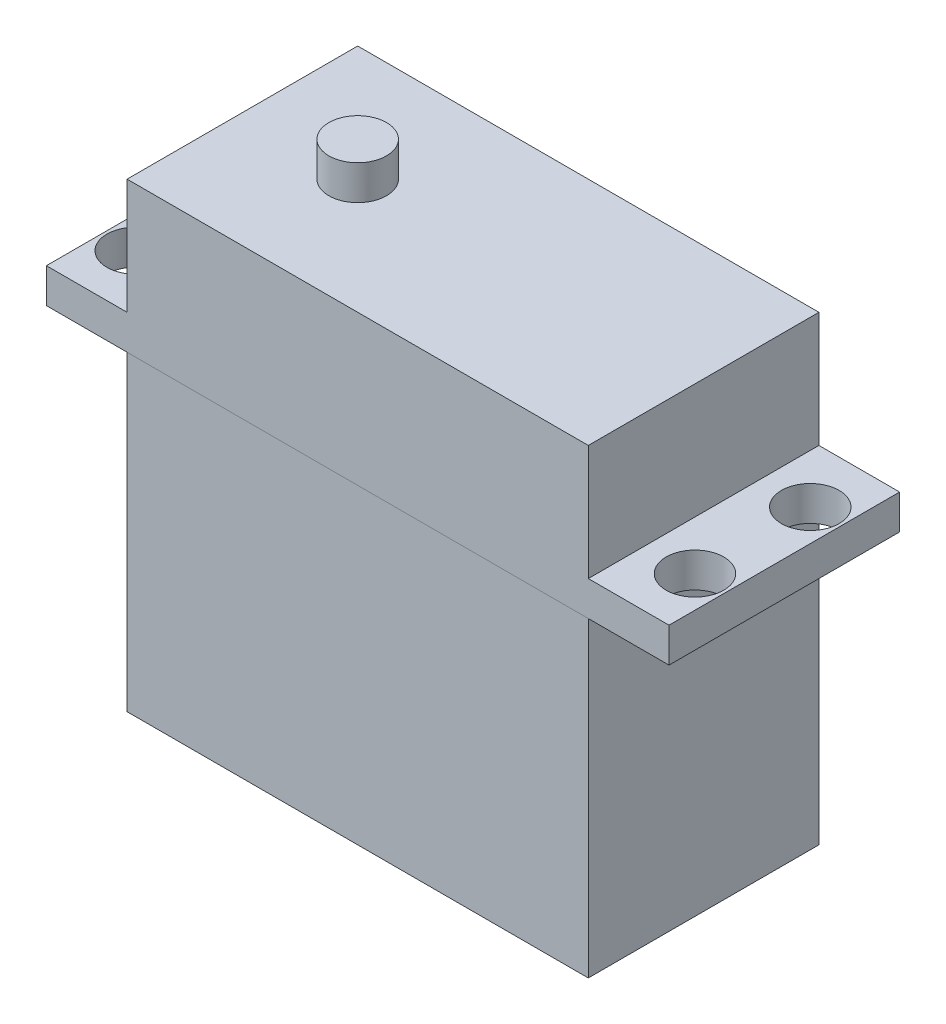
ISO-10303-21;
HEADER;
FILE_DESCRIPTION(('STEP AP214'),'2;1');
FILE_NAME('part.step','',(''),(''),'','','');
FILE_SCHEMA(('AUTOMOTIVE_DESIGN { 1 0 10303 214 1 1 1 1 }'));
ENDSEC;
DATA;
#1=APPLICATION_CONTEXT('core data for automotive mechanical design processes');
#2=APPLICATION_PROTOCOL_DEFINITION('international standard','automotive_design',2000,#1);
#3=PRODUCT_CONTEXT('',#1,'mechanical');
#4=PRODUCT('Part','Part','',(#3));
#5=PRODUCT_RELATED_PRODUCT_CATEGORY('part','',(#4));
#6=PRODUCT_DEFINITION_FORMATION('','',#4);
#7=PRODUCT_DEFINITION_CONTEXT('part definition',#1,'design');
#8=PRODUCT_DEFINITION('design','',#6,#7);
#9=PRODUCT_DEFINITION_SHAPE('','',#8);
#10=(LENGTH_UNIT() NAMED_UNIT(*) SI_UNIT(.MILLI.,.METRE.));
#11=(NAMED_UNIT(*) PLANE_ANGLE_UNIT() SI_UNIT($,.RADIAN.));
#12=(NAMED_UNIT(*) SI_UNIT($,.STERADIAN.) SOLID_ANGLE_UNIT());
#13=UNCERTAINTY_MEASURE_WITH_UNIT(LENGTH_MEASURE(1.E-05),#10,'distance_accuracy_value','');
#14=(GEOMETRIC_REPRESENTATION_CONTEXT(3) GLOBAL_UNCERTAINTY_ASSIGNED_CONTEXT((#13)) GLOBAL_UNIT_ASSIGNED_CONTEXT((#10,
#11,#12)) REPRESENTATION_CONTEXT('',''));
#15=CARTESIAN_POINT('',(0.,0.,0.));
#16=DIRECTION('',(0.,0.,1.));
#17=DIRECTION('',(1.,0.,0.));
#18=AXIS2_PLACEMENT_3D('',#15,#16,#17);
#19=CARTESIAN_POINT('',(0.,30.,0.));
#20=DIRECTION('',(0.,-1.,0.));
#21=DIRECTION('',(0.,0.,-1.));
#22=AXIS2_PLACEMENT_3D('',#19,#20,#21);
#23=PLANE('',#22);
#24=CARTESIAN_POINT('',(24.25,30.,-5.));
#25=DIRECTION('',(0.,1.,0.));
#26=DIRECTION('',(0.,0.,1.));
#27=AXIS2_PLACEMENT_3D('',#24,#25,#26);
#28=CIRCLE('',#27,2.5);
#29=CARTESIAN_POINT('',(24.25,30.,-2.5));
#30=VERTEX_POINT('',#29);
#31=EDGE_CURVE('E140',#30,#30,#28,.T.);
#32=ORIENTED_EDGE('',*,*,#31,.F.);
#33=EDGE_LOOP('',(#32));
#34=FACE_BOUND('',#33,.T.);
#35=CARTESIAN_POINT('',(24.25,30.,5.));
#36=DIRECTION('',(0.,1.,0.));
#37=DIRECTION('',(0.,0.,1.));
#38=AXIS2_PLACEMENT_3D('',#35,#36,#37);
#39=CIRCLE('',#38,2.5);
#40=CARTESIAN_POINT('',(24.25,30.,7.5));
#41=VERTEX_POINT('',#40);
#42=EDGE_CURVE('E149',#41,#41,#39,.T.);
#43=ORIENTED_EDGE('',*,*,#42,.F.);
#44=EDGE_LOOP('',(#43));
#45=FACE_BOUND('',#44,.T.);
#46=DIRECTION('',(0.,0.,-1.));
#47=VECTOR('',#46,1.);
#48=CARTESIAN_POINT('',(20.,30.,10.));
#49=LINE('',#48,#47);
#50=CARTESIAN_POINT('',(20.,30.,10.));
#51=VERTEX_POINT('',#50);
#52=CARTESIAN_POINT('',(20.,30.,-10.));
#53=VERTEX_POINT('',#52);
#54=EDGE_CURVE('E66',#51,#53,#49,.T.);
#55=ORIENTED_EDGE('',*,*,#54,.F.);
#56=DIRECTION('',(1.,0.,0.));
#57=VECTOR('',#56,1.);
#58=CARTESIAN_POINT('',(-27.,30.,10.));
#59=LINE('',#58,#57);
#60=CARTESIAN_POINT('',(27.,30.,10.));
#61=VERTEX_POINT('',#60);
#62=EDGE_CURVE('E176',#51,#61,#59,.T.);
#63=ORIENTED_EDGE('',*,*,#62,.T.);
#64=DIRECTION('',(0.,0.,-1.));
#65=VECTOR('',#64,1.);
#66=CARTESIAN_POINT('',(27.,30.,10.));
#67=LINE('',#66,#65);
#68=CARTESIAN_POINT('',(27.,30.,-10.));
#69=VERTEX_POINT('',#68);
#70=EDGE_CURVE('E167',#61,#69,#67,.T.);
#71=ORIENTED_EDGE('',*,*,#70,.T.);
#72=DIRECTION('',(-1.,0.,0.));
#73=VECTOR('',#72,1.);
#74=CARTESIAN_POINT('',(-27.,30.,-10.));
#75=LINE('',#74,#73);
#76=EDGE_CURVE('E172',#69,#53,#75,.T.);
#77=ORIENTED_EDGE('',*,*,#76,.T.);
#78=EDGE_LOOP('',(#55,#63,#71,#77));
#79=FACE_BOUND('',#78,.T.);
#80=ADVANCED_FACE('F51',(#34,#45,#79),#23,.F.);
#81=CARTESIAN_POINT('',(-24.25,30.,5.));
#82=DIRECTION('',(0.,1.,0.));
#83=DIRECTION('',(0.,0.,1.));
#84=AXIS2_PLACEMENT_3D('',#81,#82,#83);
#85=CIRCLE('',#84,2.5);
#86=CARTESIAN_POINT('',(-24.25,30.,7.5));
#87=VERTEX_POINT('',#86);
#88=EDGE_CURVE('E155',#87,#87,#85,.T.);
#89=ORIENTED_EDGE('',*,*,#88,.F.);
#90=EDGE_LOOP('',(#89));
#91=FACE_BOUND('',#90,.T.);
#92=CARTESIAN_POINT('',(-24.25,30.,-5.));
#93=DIRECTION('',(0.,1.,0.));
#94=DIRECTION('',(0.,0.,1.));
#95=AXIS2_PLACEMENT_3D('',#92,#93,#94);
#96=CIRCLE('',#95,2.5);
#97=CARTESIAN_POINT('',(-24.25,30.,-2.5));
#98=VERTEX_POINT('',#97);
#99=EDGE_CURVE('E161',#98,#98,#96,.T.);
#100=ORIENTED_EDGE('',*,*,#99,.F.);
#101=EDGE_LOOP('',(#100));
#102=FACE_BOUND('',#101,.T.);
#103=DIRECTION('',(0.,0.,1.));
#104=VECTOR('',#103,1.);
#105=CARTESIAN_POINT('',(-20.,30.,10.));
#106=LINE('',#105,#104);
#107=CARTESIAN_POINT('',(-20.,30.,-10.));
#108=VERTEX_POINT('',#107);
#109=CARTESIAN_POINT('',(-20.,30.,10.));
#110=VERTEX_POINT('',#109);
#111=EDGE_CURVE('E74',#108,#110,#106,.T.);
#112=ORIENTED_EDGE('',*,*,#111,.F.);
#113=CARTESIAN_POINT('',(-27.,30.,-10.));
#114=VERTEX_POINT('',#113);
#115=EDGE_CURVE('E170',#108,#114,#75,.T.);
#116=ORIENTED_EDGE('',*,*,#115,.T.);
#117=DIRECTION('',(0.,0.,1.));
#118=VECTOR('',#117,1.);
#119=CARTESIAN_POINT('',(-27.,30.,10.));
#120=LINE('',#119,#118);
#121=CARTESIAN_POINT('',(-27.,30.,10.));
#122=VERTEX_POINT('',#121);
#123=EDGE_CURVE('E174',#114,#122,#120,.T.);
#124=ORIENTED_EDGE('',*,*,#123,.T.);
#125=EDGE_CURVE('E177',#122,#110,#59,.T.);
#126=ORIENTED_EDGE('',*,*,#125,.T.);
#127=EDGE_LOOP('',(#112,#116,#124,#126));
#128=FACE_BOUND('',#127,.T.);
#129=ADVANCED_FACE('F215',(#91,#102,#128),#23,.F.);
#130=CARTESIAN_POINT('',(0.,27.,0.));
#131=DIRECTION('',(0.,-1.,0.));
#132=DIRECTION('',(0.,0.,-1.));
#133=AXIS2_PLACEMENT_3D('',#130,#131,#132);
#134=PLANE('',#133);
#135=CARTESIAN_POINT('',(24.25,27.,5.));
#136=DIRECTION('',(0.,1.,0.));
#137=DIRECTION('',(0.,0.,1.));
#138=AXIS2_PLACEMENT_3D('',#135,#136,#137);
#139=CIRCLE('',#138,2.5);
#140=CARTESIAN_POINT('',(24.25,27.,7.5));
#141=VERTEX_POINT('',#140);
#142=EDGE_CURVE('E147',#141,#141,#139,.T.);
#143=ORIENTED_EDGE('',*,*,#142,.T.);
#144=EDGE_LOOP('',(#143));
#145=FACE_BOUND('',#144,.T.);
#146=CARTESIAN_POINT('',(-24.25,27.,-5.));
#147=DIRECTION('',(0.,1.,0.));
#148=DIRECTION('',(0.,0.,1.));
#149=AXIS2_PLACEMENT_3D('',#146,#147,#148);
#150=CIRCLE('',#149,2.5);
#151=CARTESIAN_POINT('',(-24.25,27.,-2.5));
#152=VERTEX_POINT('',#151);
#153=EDGE_CURVE('E158',#152,#152,#150,.T.);
#154=ORIENTED_EDGE('',*,*,#153,.T.);
#155=EDGE_LOOP('',(#154));
#156=FACE_BOUND('',#155,.T.);
#157=DIRECTION('',(0.,0.,-1.));
#158=VECTOR('',#157,1.);
#159=CARTESIAN_POINT('',(27.,27.,10.));
#160=LINE('',#159,#158);
#161=CARTESIAN_POINT('',(27.,27.,10.));
#162=VERTEX_POINT('',#161);
#163=CARTESIAN_POINT('',(27.,27.,-10.));
#164=VERTEX_POINT('',#163);
#165=EDGE_CURVE('E164',#162,#164,#160,.T.);
#166=ORIENTED_EDGE('',*,*,#165,.F.);
#167=DIRECTION('',(1.,0.,0.));
#168=VECTOR('',#167,1.);
#169=CARTESIAN_POINT('',(-27.,27.,10.));
#170=LINE('',#169,#168);
#171=CARTESIAN_POINT('',(-27.,27.,10.));
#172=VERTEX_POINT('',#171);
#173=EDGE_CURVE('E171',#172,#162,#170,.T.);
#174=ORIENTED_EDGE('',*,*,#173,.F.);
#175=DIRECTION('',(0.,0.,1.));
#176=VECTOR('',#175,1.);
#177=CARTESIAN_POINT('',(-27.,27.,10.));
#178=LINE('',#177,#176);
#179=CARTESIAN_POINT('',(-27.,27.,-10.));
#180=VERTEX_POINT('',#179);
#181=EDGE_CURVE('E184',#180,#172,#178,.T.);
#182=ORIENTED_EDGE('',*,*,#181,.F.);
#183=DIRECTION('',(-1.,0.,0.));
#184=VECTOR('',#183,1.);
#185=CARTESIAN_POINT('',(-27.,27.,-10.));
#186=LINE('',#185,#184);
#187=EDGE_CURVE('E182',#164,#180,#186,.T.);
#188=ORIENTED_EDGE('',*,*,#187,.F.);
#189=EDGE_LOOP('',(#166,#174,#182,#188));
#190=FACE_BOUND('',#189,.T.);
#191=CARTESIAN_POINT('',(-24.25,27.,5.));
#192=DIRECTION('',(0.,1.,0.));
#193=DIRECTION('',(0.,0.,1.));
#194=AXIS2_PLACEMENT_3D('',#191,#192,#193);
#195=CIRCLE('',#194,2.5);
#196=CARTESIAN_POINT('',(-24.25,27.,7.5));
#197=VERTEX_POINT('',#196);
#198=EDGE_CURVE('E152',#197,#197,#195,.T.);
#199=ORIENTED_EDGE('',*,*,#198,.T.);
#200=EDGE_LOOP('',(#199));
#201=FACE_BOUND('',#200,.T.);
#202=CARTESIAN_POINT('',(24.25,27.,-5.));
#203=DIRECTION('',(0.,1.,0.));
#204=DIRECTION('',(0.,0.,1.));
#205=AXIS2_PLACEMENT_3D('',#202,#203,#204);
#206=CIRCLE('',#205,2.5);
#207=CARTESIAN_POINT('',(24.25,27.,-2.5));
#208=VERTEX_POINT('',#207);
#209=EDGE_CURVE('E137',#208,#208,#206,.T.);
#210=ORIENTED_EDGE('',*,*,#209,.T.);
#211=EDGE_LOOP('',(#210));
#212=FACE_BOUND('',#211,.T.);
#213=ADVANCED_FACE('F203',(#145,#156,#190,#201,#212),#134,.T.);
#214=CARTESIAN_POINT('',(27.,30.,10.));
#215=DIRECTION('',(-1.,0.,0.));
#216=DIRECTION('',(0.,0.,1.));
#217=AXIS2_PLACEMENT_3D('',#214,#215,#216);
#218=PLANE('',#217);
#219=ORIENTED_EDGE('',*,*,#165,.T.);
#220=DIRECTION('',(0.,-1.,0.));
#221=VECTOR('',#220,1.);
#222=CARTESIAN_POINT('',(27.,30.,-10.));
#223=LINE('',#222,#221);
#224=EDGE_CURVE('E59',#69,#164,#223,.T.);
#225=ORIENTED_EDGE('',*,*,#224,.F.);
#226=ORIENTED_EDGE('',*,*,#70,.F.);
#227=DIRECTION('',(0.,-1.,0.));
#228=VECTOR('',#227,1.);
#229=CARTESIAN_POINT('',(27.,30.,10.));
#230=LINE('',#229,#228);
#231=EDGE_CURVE('E179',#61,#162,#230,.T.);
#232=ORIENTED_EDGE('',*,*,#231,.T.);
#233=EDGE_LOOP('',(#219,#225,#226,#232));
#234=FACE_BOUND('',#233,.T.);
#235=ADVANCED_FACE('F53',(#234),#218,.F.);
#236=CARTESIAN_POINT('',(-27.,30.,-10.));
#237=DIRECTION('',(0.,0.,1.));
#238=DIRECTION('',(1.,0.,0.));
#239=AXIS2_PLACEMENT_3D('',#236,#237,#238);
#240=PLANE('',#239);
#241=ORIENTED_EDGE('',*,*,#187,.T.);
#242=DIRECTION('',(0.,-1.,0.));
#243=VECTOR('',#242,1.);
#244=CARTESIAN_POINT('',(-27.,30.,-10.));
#245=LINE('',#244,#243);
#246=EDGE_CURVE('E192',#114,#180,#245,.T.);
#247=ORIENTED_EDGE('',*,*,#246,.F.);
#248=ORIENTED_EDGE('',*,*,#115,.F.);
#249=DIRECTION('',(0.,-1.,0.));
#250=VECTOR('',#249,1.);
#251=CARTESIAN_POINT('',(-20.,40.,-10.));
#252=LINE('',#251,#250);
#253=CARTESIAN_POINT('',(-20.,40.,-10.));
#254=VERTEX_POINT('',#253);
#255=EDGE_CURVE('E122',#254,#108,#252,.T.);
#256=ORIENTED_EDGE('',*,*,#255,.F.);
#257=DIRECTION('',(-1.,0.,0.));
#258=VECTOR('',#257,1.);
#259=CARTESIAN_POINT('',(-20.,40.,-10.));
#260=LINE('',#259,#258);
#261=CARTESIAN_POINT('',(20.,40.,-10.));
#262=VERTEX_POINT('',#261);
#263=EDGE_CURVE('E116',#262,#254,#260,.T.);
#264=ORIENTED_EDGE('',*,*,#263,.F.);
#265=DIRECTION('',(0.,-1.,0.));
#266=VECTOR('',#265,1.);
#267=CARTESIAN_POINT('',(20.,40.,-10.));
#268=LINE('',#267,#266);
#269=EDGE_CURVE('E120',#262,#53,#268,.T.);
#270=ORIENTED_EDGE('',*,*,#269,.T.);
#271=ORIENTED_EDGE('',*,*,#76,.F.);
#272=ORIENTED_EDGE('',*,*,#224,.T.);
#273=EDGE_LOOP('',(#241,#247,#248,#256,#264,#270,#271,#272));
#274=FACE_BOUND('',#273,.T.);
#275=ADVANCED_FACE('F118',(#274),#240,.F.);
#276=CARTESIAN_POINT('',(-27.,30.,10.));
#277=DIRECTION('',(1.,0.,0.));
#278=DIRECTION('',(0.,0.,-1.));
#279=AXIS2_PLACEMENT_3D('',#276,#277,#278);
#280=PLANE('',#279);
#281=ORIENTED_EDGE('',*,*,#181,.T.);
#282=DIRECTION('',(0.,-1.,0.));
#283=VECTOR('',#282,1.);
#284=CARTESIAN_POINT('',(-27.,30.,10.));
#285=LINE('',#284,#283);
#286=EDGE_CURVE('E189',#122,#172,#285,.T.);
#287=ORIENTED_EDGE('',*,*,#286,.F.);
#288=ORIENTED_EDGE('',*,*,#123,.F.);
#289=ORIENTED_EDGE('',*,*,#246,.T.);
#290=EDGE_LOOP('',(#281,#287,#288,#289));
#291=FACE_BOUND('',#290,.T.);
#292=ADVANCED_FACE('F208',(#291),#280,.F.);
#293=CARTESIAN_POINT('',(-27.,30.,10.));
#294=DIRECTION('',(0.,0.,-1.));
#295=DIRECTION('',(-1.,0.,0.));
#296=AXIS2_PLACEMENT_3D('',#293,#294,#295);
#297=PLANE('',#296);
#298=ORIENTED_EDGE('',*,*,#173,.T.);
#299=ORIENTED_EDGE('',*,*,#231,.F.);
#300=ORIENTED_EDGE('',*,*,#62,.F.);
#301=DIRECTION('',(0.,-1.,0.));
#302=VECTOR('',#301,1.);
#303=CARTESIAN_POINT('',(20.,40.,10.));
#304=LINE('',#303,#302);
#305=CARTESIAN_POINT('',(20.,40.,10.));
#306=VERTEX_POINT('',#305);
#307=EDGE_CURVE('E223',#306,#51,#304,.T.);
#308=ORIENTED_EDGE('',*,*,#307,.F.);
#309=DIRECTION('',(1.,0.,0.));
#310=VECTOR('',#309,1.);
#311=CARTESIAN_POINT('',(-20.,40.,10.));
#312=LINE('',#311,#310);
#313=CARTESIAN_POINT('',(-20.,40.,10.));
#314=VERTEX_POINT('',#313);
#315=EDGE_CURVE('E131',#314,#306,#312,.T.);
#316=ORIENTED_EDGE('',*,*,#315,.F.);
#317=DIRECTION('',(0.,-1.,0.));
#318=VECTOR('',#317,1.);
#319=CARTESIAN_POINT('',(-20.,40.,10.));
#320=LINE('',#319,#318);
#321=EDGE_CURVE('E142',#314,#110,#320,.T.);
#322=ORIENTED_EDGE('',*,*,#321,.T.);
#323=ORIENTED_EDGE('',*,*,#125,.F.);
#324=ORIENTED_EDGE('',*,*,#286,.T.);
#325=EDGE_LOOP('',(#298,#299,#300,#308,#316,#322,#323,#324));
#326=FACE_BOUND('',#325,.T.);
#327=ADVANCED_FACE('F212',(#326),#297,.F.);
#328=CARTESIAN_POINT('',(-24.25,30.,-5.));
#329=DIRECTION('',(0.,-1.,0.));
#330=DIRECTION('',(0.,0.,-1.));
#331=AXIS2_PLACEMENT_3D('',#328,#329,#330);
#332=CYLINDRICAL_SURFACE('',#331,2.5);
#333=ORIENTED_EDGE('',*,*,#99,.T.);
#334=EDGE_LOOP('',(#333));
#335=FACE_BOUND('',#334,.T.);
#336=ORIENTED_EDGE('',*,*,#153,.F.);
#337=EDGE_LOOP('',(#336));
#338=FACE_BOUND('',#337,.T.);
#339=ADVANCED_FACE('F255',(#335,#338),#332,.F.);
#340=CARTESIAN_POINT('',(-24.25,30.,5.));
#341=DIRECTION('',(0.,-1.,0.));
#342=DIRECTION('',(0.,0.,-1.));
#343=AXIS2_PLACEMENT_3D('',#340,#341,#342);
#344=CYLINDRICAL_SURFACE('',#343,2.5);
#345=ORIENTED_EDGE('',*,*,#88,.T.);
#346=EDGE_LOOP('',(#345));
#347=FACE_BOUND('',#346,.T.);
#348=ORIENTED_EDGE('',*,*,#198,.F.);
#349=EDGE_LOOP('',(#348));
#350=FACE_BOUND('',#349,.T.);
#351=ADVANCED_FACE('F285',(#347,#350),#344,.F.);
#352=CARTESIAN_POINT('',(24.25,30.,5.));
#353=DIRECTION('',(0.,-1.,0.));
#354=DIRECTION('',(0.,0.,-1.));
#355=AXIS2_PLACEMENT_3D('',#352,#353,#354);
#356=CYLINDRICAL_SURFACE('',#355,2.5);
#357=ORIENTED_EDGE('',*,*,#42,.T.);
#358=EDGE_LOOP('',(#357));
#359=FACE_BOUND('',#358,.T.);
#360=ORIENTED_EDGE('',*,*,#142,.F.);
#361=EDGE_LOOP('',(#360));
#362=FACE_BOUND('',#361,.T.);
#363=ADVANCED_FACE('F293',(#359,#362),#356,.F.);
#364=CARTESIAN_POINT('',(24.25,30.,-5.));
#365=DIRECTION('',(0.,-1.,0.));
#366=DIRECTION('',(0.,0.,-1.));
#367=AXIS2_PLACEMENT_3D('',#364,#365,#366);
#368=CYLINDRICAL_SURFACE('',#367,2.5);
#369=ORIENTED_EDGE('',*,*,#31,.T.);
#370=EDGE_LOOP('',(#369));
#371=FACE_BOUND('',#370,.T.);
#372=ORIENTED_EDGE('',*,*,#209,.F.);
#373=EDGE_LOOP('',(#372));
#374=FACE_BOUND('',#373,.T.);
#375=ADVANCED_FACE('F300',(#371,#374),#368,.F.);
#376=CARTESIAN_POINT('',(20.,40.,10.));
#377=DIRECTION('',(-1.,0.,0.));
#378=DIRECTION('',(0.,0.,1.));
#379=AXIS2_PLACEMENT_3D('',#376,#377,#378);
#380=PLANE('',#379);
#381=ORIENTED_EDGE('',*,*,#54,.T.);
#382=ORIENTED_EDGE('',*,*,#269,.F.);
#383=DIRECTION('',(0.,0.,-1.));
#384=VECTOR('',#383,1.);
#385=CARTESIAN_POINT('',(20.,40.,10.));
#386=LINE('',#385,#384);
#387=EDGE_CURVE('E126',#306,#262,#386,.T.);
#388=ORIENTED_EDGE('',*,*,#387,.F.);
#389=ORIENTED_EDGE('',*,*,#307,.T.);
#390=EDGE_LOOP('',(#381,#382,#388,#389));
#391=FACE_BOUND('',#390,.T.);
#392=ADVANCED_FACE('F136',(#391),#380,.F.);
#393=CARTESIAN_POINT('',(-20.,40.,10.));
#394=DIRECTION('',(1.,0.,0.));
#395=DIRECTION('',(0.,0.,-1.));
#396=AXIS2_PLACEMENT_3D('',#393,#394,#395);
#397=PLANE('',#396);
#398=ORIENTED_EDGE('',*,*,#111,.T.);
#399=ORIENTED_EDGE('',*,*,#321,.F.);
#400=DIRECTION('',(0.,0.,1.));
#401=VECTOR('',#400,1.);
#402=CARTESIAN_POINT('',(-20.,40.,10.));
#403=LINE('',#402,#401);
#404=EDGE_CURVE('E125',#254,#314,#403,.T.);
#405=ORIENTED_EDGE('',*,*,#404,.F.);
#406=ORIENTED_EDGE('',*,*,#255,.T.);
#407=EDGE_LOOP('',(#398,#399,#405,#406));
#408=FACE_BOUND('',#407,.T.);
#409=ADVANCED_FACE('F217',(#408),#397,.F.);
#410=CARTESIAN_POINT('',(0.,40.,0.));
#411=DIRECTION('',(0.,-1.,0.));
#412=DIRECTION('',(0.,0.,-1.));
#413=AXIS2_PLACEMENT_3D('',#410,#411,#412);
#414=PLANE('',#413);
#415=CARTESIAN_POINT('',(-10.,40.,0.));
#416=DIRECTION('',(0.,-1.,0.));
#417=DIRECTION('',(0.,0.,-1.));
#418=AXIS2_PLACEMENT_3D('',#415,#416,#417);
#419=CIRCLE('',#418,2.5);
#420=CARTESIAN_POINT('',(-10.,40.,-2.5));
#421=VERTEX_POINT('',#420);
#422=EDGE_CURVE('E12',#421,#421,#419,.F.);
#423=ORIENTED_EDGE('',*,*,#422,.F.);
#424=EDGE_LOOP('',(#423));
#425=FACE_BOUND('',#424,.T.);
#426=ORIENTED_EDGE('',*,*,#387,.T.);
#427=ORIENTED_EDGE('',*,*,#263,.T.);
#428=ORIENTED_EDGE('',*,*,#404,.T.);
#429=ORIENTED_EDGE('',*,*,#315,.T.);
#430=EDGE_LOOP('',(#426,#427,#428,#429));
#431=FACE_BOUND('',#430,.T.);
#432=ADVANCED_FACE('F129',(#425,#431),#414,.F.);
#433=CARTESIAN_POINT('',(-10.,43.,0.));
#434=DIRECTION('',(0.,-1.,0.));
#435=DIRECTION('',(0.,0.,-1.));
#436=AXIS2_PLACEMENT_3D('',#433,#434,#435);
#437=CYLINDRICAL_SURFACE('',#436,2.5);
#438=CARTESIAN_POINT('',(-10.,43.,0.));
#439=DIRECTION('',(0.,1.,0.));
#440=DIRECTION('',(0.,0.,1.));
#441=AXIS2_PLACEMENT_3D('',#438,#439,#440);
#442=CIRCLE('',#441,2.5);
#443=CARTESIAN_POINT('',(-10.,43.,2.5));
#444=VERTEX_POINT('',#443);
#445=EDGE_CURVE('E219',#444,#444,#442,.T.);
#446=ORIENTED_EDGE('',*,*,#445,.F.);
#447=EDGE_LOOP('',(#446));
#448=FACE_BOUND('',#447,.T.);
#449=ORIENTED_EDGE('',*,*,#422,.T.);
#450=EDGE_LOOP('',(#449));
#451=FACE_BOUND('',#450,.T.);
#452=ADVANCED_FACE('F231',(#448,#451),#437,.T.);
#453=CARTESIAN_POINT('',(-10.,43.,0.));
#454=DIRECTION('',(0.,1.,0.));
#455=DIRECTION('',(0.,0.,1.));
#456=AXIS2_PLACEMENT_3D('',#453,#454,#455);
#457=PLANE('',#456);
#458=ORIENTED_EDGE('',*,*,#445,.T.);
#459=EDGE_LOOP('',(#458));
#460=FACE_BOUND('',#459,.T.);
#461=ADVANCED_FACE('F229',(#460),#457,.T.);
#462=CLOSED_SHELL('',(#80,#129,#213,#235,#275,#292,#327,#339,#351,#363,#375,#392,#409,#432,#452,#461));
#463=MANIFOLD_SOLID_BREP('B2',#462);
#464=CARTESIAN_POINT('',(20.,27.,10.));
#465=DIRECTION('',(-1.,0.,0.));
#466=DIRECTION('',(0.,0.,1.));
#467=AXIS2_PLACEMENT_3D('',#464,#465,#466);
#468=PLANE('',#467);
#469=DIRECTION('',(0.,0.,-1.));
#470=VECTOR('',#469,1.);
#471=CARTESIAN_POINT('',(20.,0.,10.));
#472=LINE('',#471,#470);
#473=CARTESIAN_POINT('',(20.,0.,10.));
#474=VERTEX_POINT('',#473);
#475=CARTESIAN_POINT('',(20.,0.,-10.));
#476=VERTEX_POINT('',#475);
#477=EDGE_CURVE('E459',#474,#476,#472,.T.);
#478=ORIENTED_EDGE('',*,*,#477,.T.);
#479=DIRECTION('',(0.,-1.,0.));
#480=VECTOR('',#479,1.);
#481=CARTESIAN_POINT('',(20.,27.,-10.));
#482=LINE('',#481,#480);
#483=CARTESIAN_POINT('',(20.,27.,-10.));
#484=VERTEX_POINT('',#483);
#485=EDGE_CURVE('E49',#484,#476,#482,.T.);
#486=ORIENTED_EDGE('',*,*,#485,.F.);
#487=DIRECTION('',(0.,0.,-1.));
#488=VECTOR('',#487,1.);
#489=CARTESIAN_POINT('',(20.,27.,10.));
#490=LINE('',#489,#488);
#491=CARTESIAN_POINT('',(20.,27.,10.));
#492=VERTEX_POINT('',#491);
#493=EDGE_CURVE('E447',#492,#484,#490,.T.);
#494=ORIENTED_EDGE('',*,*,#493,.F.);
#495=DIRECTION('',(0.,-1.,0.));
#496=VECTOR('',#495,1.);
#497=CARTESIAN_POINT('',(20.,27.,10.));
#498=LINE('',#497,#496);
#499=EDGE_CURVE('E455',#492,#474,#498,.T.);
#500=ORIENTED_EDGE('',*,*,#499,.T.);
#501=EDGE_LOOP('',(#478,#486,#494,#500));
#502=FACE_BOUND('',#501,.T.);
#503=ADVANCED_FACE('F396',(#502),#468,.F.);
#504=CARTESIAN_POINT('',(-20.,27.,-10.));
#505=DIRECTION('',(0.,0.,1.));
#506=DIRECTION('',(1.,0.,0.));
#507=AXIS2_PLACEMENT_3D('',#504,#505,#506);
#508=PLANE('',#507);
#509=DIRECTION('',(-1.,0.,0.));
#510=VECTOR('',#509,1.);
#511=CARTESIAN_POINT('',(-20.,0.,-10.));
#512=LINE('',#511,#510);
#513=CARTESIAN_POINT('',(-20.,0.,-10.));
#514=VERTEX_POINT('',#513);
#515=EDGE_CURVE('E451',#476,#514,#512,.T.);
#516=ORIENTED_EDGE('',*,*,#515,.T.);
#517=DIRECTION('',(0.,-1.,0.));
#518=VECTOR('',#517,1.);
#519=CARTESIAN_POINT('',(-20.,27.,-10.));
#520=LINE('',#519,#518);
#521=CARTESIAN_POINT('',(-20.,27.,-10.));
#522=VERTEX_POINT('',#521);
#523=EDGE_CURVE('E404',#522,#514,#520,.T.);
#524=ORIENTED_EDGE('',*,*,#523,.F.);
#525=DIRECTION('',(-1.,0.,0.));
#526=VECTOR('',#525,1.);
#527=CARTESIAN_POINT('',(-20.,27.,-10.));
#528=LINE('',#527,#526);
#529=EDGE_CURVE('E442',#484,#522,#528,.T.);
#530=ORIENTED_EDGE('',*,*,#529,.F.);
#531=ORIENTED_EDGE('',*,*,#485,.T.);
#532=EDGE_LOOP('',(#516,#524,#530,#531));
#533=FACE_BOUND('',#532,.T.);
#534=ADVANCED_FACE('F450',(#533),#508,.F.);
#535=CARTESIAN_POINT('',(-20.,27.,10.));
#536=DIRECTION('',(1.,0.,0.));
#537=DIRECTION('',(0.,0.,-1.));
#538=AXIS2_PLACEMENT_3D('',#535,#536,#537);
#539=PLANE('',#538);
#540=DIRECTION('',(0.,0.,1.));
#541=VECTOR('',#540,1.);
#542=CARTESIAN_POINT('',(-20.,0.,10.));
#543=LINE('',#542,#541);
#544=CARTESIAN_POINT('',(-20.,0.,10.));
#545=VERTEX_POINT('',#544);
#546=EDGE_CURVE('E429',#514,#545,#543,.T.);
#547=ORIENTED_EDGE('',*,*,#546,.T.);
#548=DIRECTION('',(0.,-1.,0.));
#549=VECTOR('',#548,1.);
#550=CARTESIAN_POINT('',(-20.,27.,10.));
#551=LINE('',#550,#549);
#552=CARTESIAN_POINT('',(-20.,27.,10.));
#553=VERTEX_POINT('',#552);
#554=EDGE_CURVE('E452',#553,#545,#551,.T.);
#555=ORIENTED_EDGE('',*,*,#554,.F.);
#556=DIRECTION('',(0.,0.,1.));
#557=VECTOR('',#556,1.);
#558=CARTESIAN_POINT('',(-20.,27.,10.));
#559=LINE('',#558,#557);
#560=EDGE_CURVE('E445',#522,#553,#559,.T.);
#561=ORIENTED_EDGE('',*,*,#560,.F.);
#562=ORIENTED_EDGE('',*,*,#523,.T.);
#563=EDGE_LOOP('',(#547,#555,#561,#562));
#564=FACE_BOUND('',#563,.T.);
#565=ADVANCED_FACE('F453',(#564),#539,.F.);
#566=CARTESIAN_POINT('',(-20.,27.,10.));
#567=DIRECTION('',(0.,0.,-1.));
#568=DIRECTION('',(-1.,0.,0.));
#569=AXIS2_PLACEMENT_3D('',#566,#567,#568);
#570=PLANE('',#569);
#571=DIRECTION('',(1.,0.,0.));
#572=VECTOR('',#571,1.);
#573=CARTESIAN_POINT('',(-20.,0.,10.));
#574=LINE('',#573,#572);
#575=EDGE_CURVE('E435',#545,#474,#574,.T.);
#576=ORIENTED_EDGE('',*,*,#575,.T.);
#577=ORIENTED_EDGE('',*,*,#499,.F.);
#578=DIRECTION('',(1.,0.,0.));
#579=VECTOR('',#578,1.);
#580=CARTESIAN_POINT('',(-20.,27.,10.));
#581=LINE('',#580,#579);
#582=EDGE_CURVE('E412',#553,#492,#581,.T.);
#583=ORIENTED_EDGE('',*,*,#582,.F.);
#584=ORIENTED_EDGE('',*,*,#554,.T.);
#585=EDGE_LOOP('',(#576,#577,#583,#584));
#586=FACE_BOUND('',#585,.T.);
#587=ADVANCED_FACE('F466',(#586),#570,.F.);
#588=CARTESIAN_POINT('',(0.,27.,0.));
#589=DIRECTION('',(0.,-1.,0.));
#590=DIRECTION('',(0.,0.,-1.));
#591=AXIS2_PLACEMENT_3D('',#588,#589,#590);
#592=PLANE('',#591);
#593=ORIENTED_EDGE('',*,*,#493,.T.);
#594=ORIENTED_EDGE('',*,*,#529,.T.);
#595=ORIENTED_EDGE('',*,*,#560,.T.);
#596=ORIENTED_EDGE('',*,*,#582,.T.);
#597=EDGE_LOOP('',(#593,#594,#595,#596));
#598=FACE_BOUND('',#597,.T.);
#599=ADVANCED_FACE('F443',(#598),#592,.F.);
#600=CARTESIAN_POINT('',(0.,0.,0.));
#601=DIRECTION('',(0.,-1.,0.));
#602=DIRECTION('',(0.,0.,-1.));
#603=AXIS2_PLACEMENT_3D('',#600,#601,#602);
#604=PLANE('',#603);
#605=ORIENTED_EDGE('',*,*,#477,.F.);
#606=ORIENTED_EDGE('',*,*,#575,.F.);
#607=ORIENTED_EDGE('',*,*,#546,.F.);
#608=ORIENTED_EDGE('',*,*,#515,.F.);
#609=EDGE_LOOP('',(#605,#606,#607,#608));
#610=FACE_BOUND('',#609,.T.);
#611=ADVANCED_FACE('F469',(#610),#604,.T.);
#612=CLOSED_SHELL('',(#503,#534,#565,#587,#599,#611));
#613=MANIFOLD_SOLID_BREP('B6',#612);
#614=ADVANCED_BREP_SHAPE_REPRESENTATION('',(#18,#463,#613),#14);
#615=SHAPE_DEFINITION_REPRESENTATION(#9,#614);
ENDSEC;
END-ISO-10303-21;
